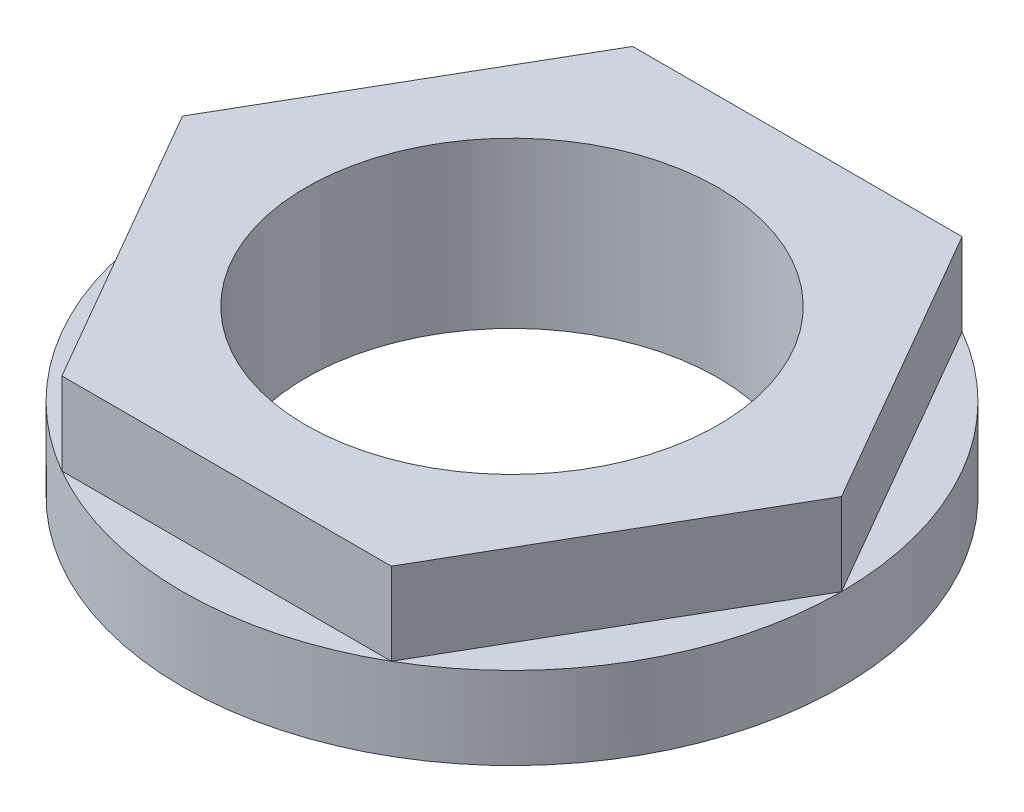
ISO-10303-21;
HEADER;
FILE_DESCRIPTION(('STEP AP214'),'2;1');
FILE_NAME('part.step','',(''),(''),'','','');
FILE_SCHEMA(('AUTOMOTIVE_DESIGN { 1 0 10303 214 1 1 1 1 }'));
ENDSEC;
DATA;
#1=APPLICATION_CONTEXT('core data for automotive mechanical design processes');
#2=APPLICATION_PROTOCOL_DEFINITION('international standard','automotive_design',2000,#1);
#3=PRODUCT_CONTEXT('',#1,'mechanical');
#4=PRODUCT('Part','Part','',(#3));
#5=PRODUCT_RELATED_PRODUCT_CATEGORY('part','',(#4));
#6=PRODUCT_DEFINITION_FORMATION('','',#4);
#7=PRODUCT_DEFINITION_CONTEXT('part definition',#1,'design');
#8=PRODUCT_DEFINITION('design','',#6,#7);
#9=PRODUCT_DEFINITION_SHAPE('','',#8);
#10=(LENGTH_UNIT() NAMED_UNIT(*) SI_UNIT(.MILLI.,.METRE.));
#11=(NAMED_UNIT(*) PLANE_ANGLE_UNIT() SI_UNIT($,.RADIAN.));
#12=(NAMED_UNIT(*) SI_UNIT($,.STERADIAN.) SOLID_ANGLE_UNIT());
#13=UNCERTAINTY_MEASURE_WITH_UNIT(LENGTH_MEASURE(1.E-05),#10,'distance_accuracy_value','');
#14=(GEOMETRIC_REPRESENTATION_CONTEXT(3) GLOBAL_UNCERTAINTY_ASSIGNED_CONTEXT((#13)) GLOBAL_UNIT_ASSIGNED_CONTEXT((#10,
#11,#12)) REPRESENTATION_CONTEXT('',''));
#15=CARTESIAN_POINT('',(0.,0.,0.));
#16=DIRECTION('',(0.,0.,1.));
#17=DIRECTION('',(1.,0.,0.));
#18=AXIS2_PLACEMENT_3D('',#15,#16,#17);
#19=CARTESIAN_POINT('',(0.,3.,0.));
#20=DIRECTION('',(0.,1.,0.));
#21=DIRECTION('',(0.,0.,1.));
#22=AXIS2_PLACEMENT_3D('',#19,#20,#21);
#23=PLANE('',#22);
#24=DIRECTION('',(0.5,0.,-0.866025403784438));
#25=VECTOR('',#24,1.);
#26=CARTESIAN_POINT('',(5.99999999999994,3.,10.3923048454133));
#27=LINE('',#26,#25);
#28=CARTESIAN_POINT('',(5.99999999999986,3.,10.3923048454133));
#29=VERTEX_POINT('',#28);
#30=CARTESIAN_POINT('',(12.,3.,0.));
#31=VERTEX_POINT('',#30);
#32=EDGE_CURVE('E124',#29,#31,#27,.T.);
#33=ORIENTED_EDGE('',*,*,#32,.F.);
#34=CARTESIAN_POINT('',(0.,3.,0.));
#35=DIRECTION('',(0.,1.,0.));
#36=DIRECTION('',(0.,0.,1.));
#37=AXIS2_PLACEMENT_3D('',#34,#35,#36);
#38=CIRCLE('',#37,12.);
#39=EDGE_CURVE('E11',#29,#31,#38,.T.);
#40=ORIENTED_EDGE('',*,*,#39,.T.);
#41=EDGE_LOOP('',(#33,#40));
#42=FACE_BOUND('',#41,.T.);
#43=ADVANCED_FACE('F43',(#42),#23,.T.);
#44=DIRECTION('',(1.,0.,0.));
#45=VECTOR('',#44,1.);
#46=CARTESIAN_POINT('',(-6.0000000000001,3.,10.3923048454133));
#47=LINE('',#46,#45);
#48=CARTESIAN_POINT('',(-6.00000000000015,3.,10.3923048454132));
#49=VERTEX_POINT('',#48);
#50=EDGE_CURVE('E59',#49,#29,#47,.T.);
#51=ORIENTED_EDGE('',*,*,#50,.F.);
#52=EDGE_CURVE('E53',#49,#29,#38,.T.);
#53=ORIENTED_EDGE('',*,*,#52,.T.);
#54=EDGE_LOOP('',(#51,#53));
#55=FACE_BOUND('',#54,.T.);
#56=ADVANCED_FACE('F175',(#55),#23,.T.);
#57=DIRECTION('',(0.499999999999994,0.,0.866025403784442));
#58=VECTOR('',#57,1.);
#59=CARTESIAN_POINT('',(-12.,3.,0.));
#60=LINE('',#59,#58);
#61=CARTESIAN_POINT('',(-12.,3.,-1.58727198051878E-13));
#62=VERTEX_POINT('',#61);
#63=EDGE_CURVE('E66',#62,#49,#60,.T.);
#64=ORIENTED_EDGE('',*,*,#63,.F.);
#65=EDGE_CURVE('E203',#62,#49,#38,.T.);
#66=ORIENTED_EDGE('',*,*,#65,.T.);
#67=EDGE_LOOP('',(#64,#66));
#68=FACE_BOUND('',#67,.T.);
#69=ADVANCED_FACE('F182',(#68),#23,.T.);
#70=DIRECTION('',(-0.500000000000006,0.,0.866025403784435));
#71=VECTOR('',#70,1.);
#72=CARTESIAN_POINT('',(-5.99999999999995,3.,-10.3923048454133));
#73=LINE('',#72,#71);
#74=CARTESIAN_POINT('',(-5.99999999999986,3.,-10.3923048454133));
#75=VERTEX_POINT('',#74);
#76=EDGE_CURVE('E144',#75,#62,#73,.T.);
#77=ORIENTED_EDGE('',*,*,#76,.F.);
#78=EDGE_CURVE('E204',#75,#62,#38,.T.);
#79=ORIENTED_EDGE('',*,*,#78,.T.);
#80=EDGE_LOOP('',(#77,#79));
#81=FACE_BOUND('',#80,.T.);
#82=ADVANCED_FACE('F192',(#81),#23,.T.);
#83=DIRECTION('',(-1.,0.,0.));
#84=VECTOR('',#83,1.);
#85=CARTESIAN_POINT('',(6.00000000000009,3.,-10.3923048454133));
#86=LINE('',#85,#84);
#87=CARTESIAN_POINT('',(6.00000000000009,3.,-10.3923048454133));
#88=VERTEX_POINT('',#87);
#89=EDGE_CURVE('E147',#88,#75,#86,.T.);
#90=ORIENTED_EDGE('',*,*,#89,.F.);
#91=EDGE_CURVE('E201',#88,#75,#38,.T.);
#92=ORIENTED_EDGE('',*,*,#91,.T.);
#93=EDGE_LOOP('',(#90,#92));
#94=FACE_BOUND('',#93,.T.);
#95=ADVANCED_FACE('F185',(#94),#23,.T.);
#96=DIRECTION('',(-0.499999999999994,0.,-0.866025403784442));
#97=VECTOR('',#96,1.);
#98=CARTESIAN_POINT('',(12.,3.,0.));
#99=LINE('',#98,#97);
#100=EDGE_CURVE('E150',#31,#88,#99,.T.);
#101=ORIENTED_EDGE('',*,*,#100,.F.);
#102=EDGE_CURVE('E52',#31,#88,#38,.T.);
#103=ORIENTED_EDGE('',*,*,#102,.T.);
#104=EDGE_LOOP('',(#101,#103));
#105=FACE_BOUND('',#104,.T.);
#106=ADVANCED_FACE('F178',(#105),#23,.T.);
#107=CARTESIAN_POINT('',(0.,0.,0.));
#108=DIRECTION('',(0.,1.,0.));
#109=DIRECTION('',(0.,0.,1.));
#110=AXIS2_PLACEMENT_3D('',#107,#108,#109);
#111=PLANE('',#110);
#112=CARTESIAN_POINT('',(0.,0.,0.));
#113=DIRECTION('',(0.,1.,0.));
#114=DIRECTION('',(0.,0.,1.));
#115=AXIS2_PLACEMENT_3D('',#112,#113,#114);
#116=CIRCLE('',#115,12.);
#117=CARTESIAN_POINT('',(0.,0.,12.));
#118=VERTEX_POINT('',#117);
#119=EDGE_CURVE('E47',#118,#118,#116,.T.);
#120=ORIENTED_EDGE('',*,*,#119,.F.);
#121=EDGE_LOOP('',(#120));
#122=FACE_BOUND('',#121,.T.);
#123=CARTESIAN_POINT('',(0.,0.,0.));
#124=DIRECTION('',(0.,1.,0.));
#125=DIRECTION('',(0.,0.,1.));
#126=AXIS2_PLACEMENT_3D('',#123,#124,#125);
#127=CIRCLE('',#126,7.5);
#128=CARTESIAN_POINT('',(0.,0.,7.5));
#129=VERTEX_POINT('',#128);
#130=EDGE_CURVE('E125',#129,#129,#127,.T.);
#131=ORIENTED_EDGE('',*,*,#130,.T.);
#132=EDGE_LOOP('',(#131));
#133=FACE_BOUND('',#132,.T.);
#134=ADVANCED_FACE('F184',(#122,#133),#111,.F.);
#135=CARTESIAN_POINT('',(0.,3.,0.));
#136=DIRECTION('',(0.,-1.,0.));
#137=DIRECTION('',(0.,0.,-1.));
#138=AXIS2_PLACEMENT_3D('',#135,#136,#137);
#139=CYLINDRICAL_SURFACE('',#138,12.);
#140=ORIENTED_EDGE('',*,*,#39,.F.);
#141=ORIENTED_EDGE('',*,*,#52,.F.);
#142=ORIENTED_EDGE('',*,*,#65,.F.);
#143=ORIENTED_EDGE('',*,*,#78,.F.);
#144=ORIENTED_EDGE('',*,*,#91,.F.);
#145=ORIENTED_EDGE('',*,*,#102,.F.);
#146=EDGE_LOOP('',(#140,#141,#142,#143,#144,#145));
#147=FACE_BOUND('',#146,.T.);
#148=ORIENTED_EDGE('',*,*,#119,.T.);
#149=EDGE_LOOP('',(#148));
#150=FACE_BOUND('',#149,.T.);
#151=ADVANCED_FACE('F45',(#147,#150),#139,.T.);
#152=CARTESIAN_POINT('',(0.,3.,0.));
#153=DIRECTION('',(0.,-1.,0.));
#154=DIRECTION('',(0.,0.,-1.));
#155=AXIS2_PLACEMENT_3D('',#152,#153,#154);
#156=CYLINDRICAL_SURFACE('',#155,7.5);
#157=ORIENTED_EDGE('',*,*,#130,.F.);
#158=EDGE_LOOP('',(#157));
#159=FACE_BOUND('',#158,.T.);
#160=CARTESIAN_POINT('',(0.,6.,0.));
#161=DIRECTION('',(0.,1.,0.));
#162=DIRECTION('',(0.,0.,1.));
#163=AXIS2_PLACEMENT_3D('',#160,#161,#162);
#164=CIRCLE('',#163,7.5);
#165=CARTESIAN_POINT('',(0.,6.,7.5));
#166=VERTEX_POINT('',#165);
#167=EDGE_CURVE('E153',#166,#166,#164,.T.);
#168=ORIENTED_EDGE('',*,*,#167,.T.);
#169=EDGE_LOOP('',(#168));
#170=FACE_BOUND('',#169,.T.);
#171=ADVANCED_FACE('F163',(#159,#170),#156,.F.);
#172=CARTESIAN_POINT('',(0.,6.,0.));
#173=DIRECTION('',(0.,1.,0.));
#174=DIRECTION('',(0.,0.,1.));
#175=AXIS2_PLACEMENT_3D('',#172,#173,#174);
#176=PLANE('',#175);
#177=DIRECTION('',(0.5,0.,-0.866025403784438));
#178=VECTOR('',#177,1.);
#179=CARTESIAN_POINT('',(5.99999999999994,6.,10.3923048454133));
#180=LINE('',#179,#178);
#181=CARTESIAN_POINT('',(5.99999999999994,6.,10.3923048454133));
#182=VERTEX_POINT('',#181);
#183=CARTESIAN_POINT('',(12.,6.,0.));
#184=VERTEX_POINT('',#183);
#185=EDGE_CURVE('E112',#182,#184,#180,.T.);
#186=ORIENTED_EDGE('',*,*,#185,.T.);
#187=DIRECTION('',(-0.499999999999994,0.,-0.866025403784442));
#188=VECTOR('',#187,1.);
#189=CARTESIAN_POINT('',(12.,6.,0.));
#190=LINE('',#189,#188);
#191=CARTESIAN_POINT('',(6.00000000000009,6.,-10.3923048454133));
#192=VERTEX_POINT('',#191);
#193=EDGE_CURVE('E100',#184,#192,#190,.T.);
#194=ORIENTED_EDGE('',*,*,#193,.T.);
#195=DIRECTION('',(-1.,0.,0.));
#196=VECTOR('',#195,1.);
#197=CARTESIAN_POINT('',(6.00000000000009,6.,-10.3923048454133));
#198=LINE('',#197,#196);
#199=CARTESIAN_POINT('',(-5.99999999999995,6.,-10.3923048454133));
#200=VERTEX_POINT('',#199);
#201=EDGE_CURVE('E111',#192,#200,#198,.T.);
#202=ORIENTED_EDGE('',*,*,#201,.T.);
#203=DIRECTION('',(-0.500000000000006,0.,0.866025403784435));
#204=VECTOR('',#203,1.);
#205=CARTESIAN_POINT('',(-5.99999999999995,6.,-10.3923048454133));
#206=LINE('',#205,#204);
#207=CARTESIAN_POINT('',(-12.,6.,0.));
#208=VERTEX_POINT('',#207);
#209=EDGE_CURVE('E157',#200,#208,#206,.T.);
#210=ORIENTED_EDGE('',*,*,#209,.T.);
#211=DIRECTION('',(0.499999999999994,0.,0.866025403784442));
#212=VECTOR('',#211,1.);
#213=CARTESIAN_POINT('',(-12.,6.,0.));
#214=LINE('',#213,#212);
#215=CARTESIAN_POINT('',(-6.0000000000001,6.,10.3923048454133));
#216=VERTEX_POINT('',#215);
#217=EDGE_CURVE('E155',#208,#216,#214,.T.);
#218=ORIENTED_EDGE('',*,*,#217,.T.);
#219=DIRECTION('',(1.,0.,0.));
#220=VECTOR('',#219,1.);
#221=CARTESIAN_POINT('',(-6.0000000000001,6.,10.3923048454133));
#222=LINE('',#221,#220);
#223=EDGE_CURVE('E118',#216,#182,#222,.T.);
#224=ORIENTED_EDGE('',*,*,#223,.T.);
#225=EDGE_LOOP('',(#186,#194,#202,#210,#218,#224));
#226=FACE_BOUND('',#225,.T.);
#227=ORIENTED_EDGE('',*,*,#167,.F.);
#228=EDGE_LOOP('',(#227));
#229=FACE_BOUND('',#228,.T.);
#230=ADVANCED_FACE('F115',(#226,#229),#176,.T.);
#231=CARTESIAN_POINT('',(5.99999999999994,6.,10.3923048454133));
#232=DIRECTION('',(-0.866025403784438,0.,-0.500000000000001));
#233=DIRECTION('',(-0.500000000000001,0.,0.866025403784438));
#234=AXIS2_PLACEMENT_3D('',#231,#232,#233);
#235=PLANE('',#234);
#236=ORIENTED_EDGE('',*,*,#32,.T.);
#237=DIRECTION('',(0.,-1.,0.));
#238=VECTOR('',#237,1.);
#239=CARTESIAN_POINT('',(12.,6.,0.));
#240=LINE('',#239,#238);
#241=EDGE_CURVE('E105',#184,#31,#240,.T.);
#242=ORIENTED_EDGE('',*,*,#241,.F.);
#243=ORIENTED_EDGE('',*,*,#185,.F.);
#244=DIRECTION('',(0.,-1.,0.));
#245=VECTOR('',#244,1.);
#246=CARTESIAN_POINT('',(5.99999999999994,6.,10.3923048454133));
#247=LINE('',#246,#245);
#248=EDGE_CURVE('E140',#182,#29,#247,.T.);
#249=ORIENTED_EDGE('',*,*,#248,.T.);
#250=EDGE_LOOP('',(#236,#242,#243,#249));
#251=FACE_BOUND('',#250,.T.);
#252=ADVANCED_FACE('F123',(#251),#235,.F.);
#253=CARTESIAN_POINT('',(12.,6.,0.));
#254=DIRECTION('',(-0.866025403784442,0.,0.499999999999995));
#255=DIRECTION('',(0.499999999999995,0.,0.866025403784442));
#256=AXIS2_PLACEMENT_3D('',#253,#254,#255);
#257=PLANE('',#256);
#258=ORIENTED_EDGE('',*,*,#100,.T.);
#259=DIRECTION('',(0.,-1.,0.));
#260=VECTOR('',#259,1.);
#261=CARTESIAN_POINT('',(6.00000000000009,6.,-10.3923048454133));
#262=LINE('',#261,#260);
#263=EDGE_CURVE('E108',#192,#88,#262,.T.);
#264=ORIENTED_EDGE('',*,*,#263,.F.);
#265=ORIENTED_EDGE('',*,*,#193,.F.);
#266=ORIENTED_EDGE('',*,*,#241,.T.);
#267=EDGE_LOOP('',(#258,#264,#265,#266));
#268=FACE_BOUND('',#267,.T.);
#269=ADVANCED_FACE('F103',(#268),#257,.F.);
#270=CARTESIAN_POINT('',(6.00000000000009,6.,-10.3923048454133));
#271=DIRECTION('',(0.,0.,1.));
#272=DIRECTION('',(1.,0.,0.));
#273=AXIS2_PLACEMENT_3D('',#270,#271,#272);
#274=PLANE('',#273);
#275=ORIENTED_EDGE('',*,*,#89,.T.);
#276=DIRECTION('',(0.,-1.,0.));
#277=VECTOR('',#276,1.);
#278=CARTESIAN_POINT('',(-5.99999999999995,6.,-10.3923048454133));
#279=LINE('',#278,#277);
#280=EDGE_CURVE('E129',#200,#75,#279,.T.);
#281=ORIENTED_EDGE('',*,*,#280,.F.);
#282=ORIENTED_EDGE('',*,*,#201,.F.);
#283=ORIENTED_EDGE('',*,*,#263,.T.);
#284=EDGE_LOOP('',(#275,#281,#282,#283));
#285=FACE_BOUND('',#284,.T.);
#286=ADVANCED_FACE('F296',(#285),#274,.F.);
#287=CARTESIAN_POINT('',(-5.99999999999995,6.,-10.3923048454133));
#288=DIRECTION('',(0.866025403784435,0.,0.500000000000006));
#289=DIRECTION('',(0.500000000000006,0.,-0.866025403784435));
#290=AXIS2_PLACEMENT_3D('',#287,#288,#289);
#291=PLANE('',#290);
#292=ORIENTED_EDGE('',*,*,#76,.T.);
#293=DIRECTION('',(0.,-1.,0.));
#294=VECTOR('',#293,1.);
#295=CARTESIAN_POINT('',(-12.,6.,0.));
#296=LINE('',#295,#294);
#297=EDGE_CURVE('E134',#208,#62,#296,.T.);
#298=ORIENTED_EDGE('',*,*,#297,.F.);
#299=ORIENTED_EDGE('',*,*,#209,.F.);
#300=ORIENTED_EDGE('',*,*,#280,.T.);
#301=EDGE_LOOP('',(#292,#298,#299,#300));
#302=FACE_BOUND('',#301,.T.);
#303=ADVANCED_FACE('F304',(#302),#291,.F.);
#304=CARTESIAN_POINT('',(-12.,6.,0.));
#305=DIRECTION('',(0.866025403784442,0.,-0.499999999999994));
#306=DIRECTION('',(-0.499999999999994,0.,-0.866025403784442));
#307=AXIS2_PLACEMENT_3D('',#304,#305,#306);
#308=PLANE('',#307);
#309=ORIENTED_EDGE('',*,*,#63,.T.);
#310=DIRECTION('',(0.,-1.,0.));
#311=VECTOR('',#310,1.);
#312=CARTESIAN_POINT('',(-6.0000000000001,6.,10.3923048454133));
#313=LINE('',#312,#311);
#314=EDGE_CURVE('E137',#216,#49,#313,.T.);
#315=ORIENTED_EDGE('',*,*,#314,.F.);
#316=ORIENTED_EDGE('',*,*,#217,.F.);
#317=ORIENTED_EDGE('',*,*,#297,.T.);
#318=EDGE_LOOP('',(#309,#315,#316,#317));
#319=FACE_BOUND('',#318,.T.);
#320=ADVANCED_FACE('F313',(#319),#308,.F.);
#321=CARTESIAN_POINT('',(-6.0000000000001,6.,10.3923048454133));
#322=DIRECTION('',(0.,0.,-1.));
#323=DIRECTION('',(-1.,0.,0.));
#324=AXIS2_PLACEMENT_3D('',#321,#322,#323);
#325=PLANE('',#324);
#326=ORIENTED_EDGE('',*,*,#50,.T.);
#327=ORIENTED_EDGE('',*,*,#248,.F.);
#328=ORIENTED_EDGE('',*,*,#223,.F.);
#329=ORIENTED_EDGE('',*,*,#314,.T.);
#330=EDGE_LOOP('',(#326,#327,#328,#329));
#331=FACE_BOUND('',#330,.T.);
#332=ADVANCED_FACE('F322',(#331),#325,.F.);
#333=CLOSED_SHELL('',(#43,#56,#69,#82,#95,#106,#134,#151,#171,#230,#252,#269,#286,#303,#320,#332));
#334=MANIFOLD_SOLID_BREP('B2',#333);
#335=ADVANCED_BREP_SHAPE_REPRESENTATION('',(#18,#334),#14);
#336=SHAPE_DEFINITION_REPRESENTATION(#9,#335);
ENDSEC;
END-ISO-10303-21;
